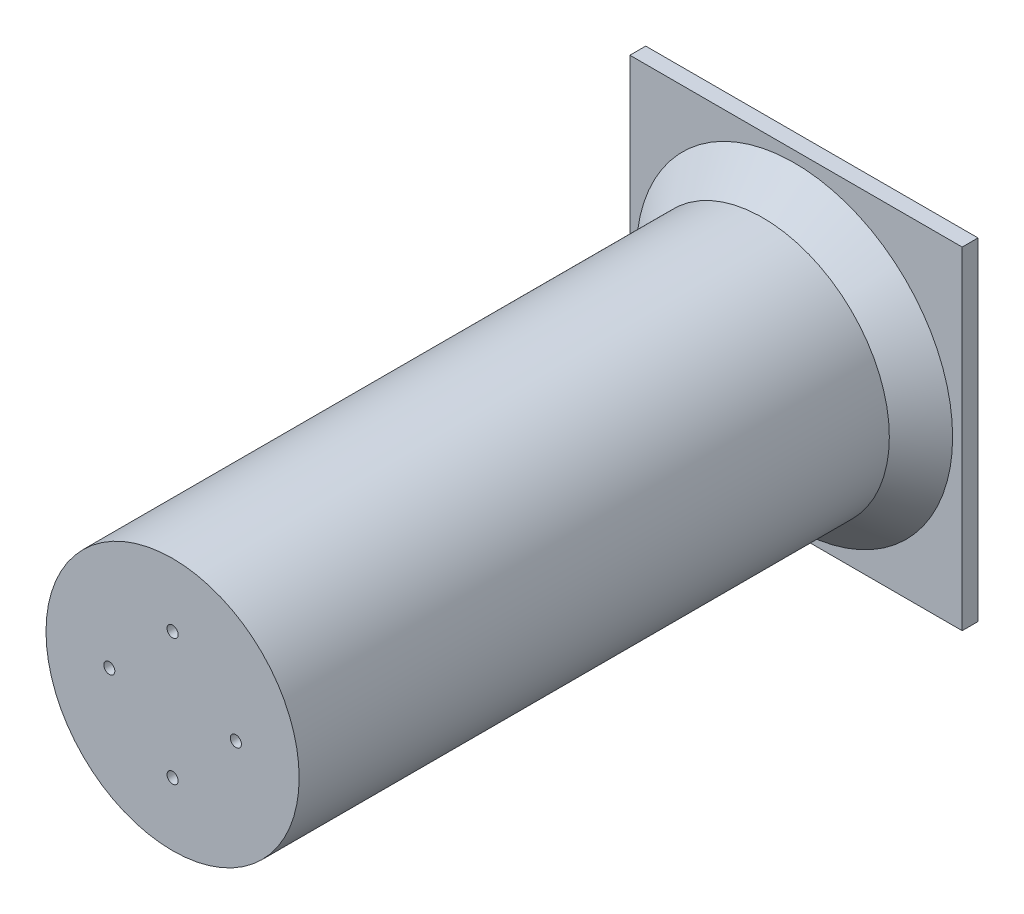
ISO-10303-21;
HEADER;
FILE_DESCRIPTION(('STEP AP214'),'2;1');
FILE_NAME('part.step','',(''),(''),'','','');
FILE_SCHEMA(('AUTOMOTIVE_DESIGN { 1 0 10303 214 1 1 1 1 }'));
ENDSEC;
DATA;
#1=APPLICATION_CONTEXT('core data for automotive mechanical design processes');
#2=APPLICATION_PROTOCOL_DEFINITION('international standard','automotive_design',2000,#1);
#3=PRODUCT_CONTEXT('',#1,'mechanical');
#4=PRODUCT('Part','Part','',(#3));
#5=PRODUCT_RELATED_PRODUCT_CATEGORY('part','',(#4));
#6=PRODUCT_DEFINITION_FORMATION('','',#4);
#7=PRODUCT_DEFINITION_CONTEXT('part definition',#1,'design');
#8=PRODUCT_DEFINITION('design','',#6,#7);
#9=PRODUCT_DEFINITION_SHAPE('','',#8);
#10=(LENGTH_UNIT() NAMED_UNIT(*) SI_UNIT(.MILLI.,.METRE.));
#11=(NAMED_UNIT(*) PLANE_ANGLE_UNIT() SI_UNIT($,.RADIAN.));
#12=(NAMED_UNIT(*) SI_UNIT($,.STERADIAN.) SOLID_ANGLE_UNIT());
#13=UNCERTAINTY_MEASURE_WITH_UNIT(LENGTH_MEASURE(1.E-05),#10,'distance_accuracy_value','');
#14=(GEOMETRIC_REPRESENTATION_CONTEXT(3) GLOBAL_UNCERTAINTY_ASSIGNED_CONTEXT((#13)) GLOBAL_UNIT_ASSIGNED_CONTEXT((#10,
#11,#12)) REPRESENTATION_CONTEXT('',''));
#15=CARTESIAN_POINT('',(0.,0.,0.));
#16=DIRECTION('',(0.,0.,1.));
#17=DIRECTION('',(1.,0.,0.));
#18=AXIS2_PLACEMENT_3D('',#15,#16,#17);
#19=CARTESIAN_POINT('',(-55.1017068131869,20.26268,-15.));
#20=DIRECTION('',(0.,0.,1.));
#21=DIRECTION('',(1.,0.,0.));
#22=AXIS2_PLACEMENT_3D('',#19,#20,#21);
#23=PLANE('',#22);
#24=CARTESIAN_POINT('',(-55.1017068131869,20.26268,-15.));
#25=DIRECTION('',(0.,0.,1.));
#26=DIRECTION('',(1.,0.,0.));
#27=AXIS2_PLACEMENT_3D('',#24,#25,#26);
#28=CIRCLE('',#27,1.75);
#29=CARTESIAN_POINT('',(-53.3517068131869,20.26268,-15.));
#30=VERTEX_POINT('',#29);
#31=EDGE_CURVE('E155',#30,#30,#28,.T.);
#32=ORIENTED_EDGE('',*,*,#31,.T.);
#33=EDGE_LOOP('',(#32));
#34=FACE_BOUND('',#33,.T.);
#35=ADVANCED_FACE('F47',(#34),#23,.T.);
#36=CARTESIAN_POINT('',(-55.1017068131869,20.26268,-15.));
#37=DIRECTION('',(0.,0.,1.));
#38=DIRECTION('',(1.,0.,0.));
#39=AXIS2_PLACEMENT_3D('',#36,#37,#38);
#40=CYLINDRICAL_SURFACE('',#39,1.75);
#41=CARTESIAN_POINT('',(-55.1017068131869,20.26268,0.));
#42=DIRECTION('',(0.,0.,-1.));
#43=DIRECTION('',(-1.,0.,0.));
#44=AXIS2_PLACEMENT_3D('',#41,#42,#43);
#45=CIRCLE('',#44,1.75);
#46=CARTESIAN_POINT('',(-56.8517068131869,20.26268,0.));
#47=VERTEX_POINT('',#46);
#48=EDGE_CURVE('E137',#47,#47,#45,.F.);
#49=ORIENTED_EDGE('',*,*,#48,.T.);
#50=EDGE_LOOP('',(#49));
#51=FACE_BOUND('',#50,.T.);
#52=ORIENTED_EDGE('',*,*,#31,.F.);
#53=EDGE_LOOP('',(#52));
#54=FACE_BOUND('',#53,.T.);
#55=ADVANCED_FACE('F187',(#51,#54),#40,.F.);
#56=CARTESIAN_POINT('',(-117.291706813187,97.76268,0.));
#57=DIRECTION('',(0.,0.,-1.));
#58=DIRECTION('',(-1.,0.,0.));
#59=AXIS2_PLACEMENT_3D('',#56,#57,#58);
#60=PLANE('',#59);
#61=CARTESIAN_POINT('',(-75.1017068131863,0.262679999999647,0.));
#62=DIRECTION('',(0.,0.,-1.));
#63=DIRECTION('',(-1.,0.,0.));
#64=AXIS2_PLACEMENT_3D('',#61,#62,#63);
#65=CIRCLE('',#64,1.75);
#66=CARTESIAN_POINT('',(-76.8517068131863,0.262679999999647,0.));
#67=VERTEX_POINT('',#66);
#68=EDGE_CURVE('E146',#67,#67,#65,.F.);
#69=ORIENTED_EDGE('',*,*,#68,.F.);
#70=EDGE_LOOP('',(#69));
#71=FACE_BOUND('',#70,.T.);
#72=CARTESIAN_POINT('',(-35.1017068131875,0.26268000000033,0.));
#73=DIRECTION('',(0.,0.,-1.));
#74=DIRECTION('',(-1.,0.,0.));
#75=AXIS2_PLACEMENT_3D('',#72,#73,#74);
#76=CIRCLE('',#75,1.75000000000019);
#77=CARTESIAN_POINT('',(-36.8517068131877,0.26268000000033,0.));
#78=VERTEX_POINT('',#77);
#79=EDGE_CURVE('E138',#78,#78,#76,.F.);
#80=ORIENTED_EDGE('',*,*,#79,.F.);
#81=EDGE_LOOP('',(#80));
#82=FACE_BOUND('',#81,.T.);
#83=ORIENTED_EDGE('',*,*,#48,.F.);
#84=EDGE_LOOP('',(#83));
#85=FACE_BOUND('',#84,.T.);
#86=CARTESIAN_POINT('',(-55.1017068131866,-19.7373199999994,0.));
#87=DIRECTION('',(0.,0.,-1.));
#88=DIRECTION('',(-1.,0.,0.));
#89=AXIS2_PLACEMENT_3D('',#86,#87,#88);
#90=CIRCLE('',#89,1.74999999999955);
#91=CARTESIAN_POINT('',(-56.8517068131861,-19.7373199999994,0.));
#92=VERTEX_POINT('',#91);
#93=EDGE_CURVE('E142',#92,#92,#90,.F.);
#94=ORIENTED_EDGE('',*,*,#93,.F.);
#95=EDGE_LOOP('',(#94));
#96=FACE_BOUND('',#95,.T.);
#97=CARTESIAN_POINT('',(-55.1017068131869,0.262679999999987,0.));
#98=DIRECTION('',(0.,0.,-1.));
#99=DIRECTION('',(-1.,0.,0.));
#100=AXIS2_PLACEMENT_3D('',#97,#98,#99);
#101=CIRCLE('',#100,40.);
#102=CARTESIAN_POINT('',(-95.1017068131869,0.262679999999987,0.));
#103=VERTEX_POINT('',#102);
#104=EDGE_CURVE('E150',#103,#103,#101,.T.);
#105=ORIENTED_EDGE('',*,*,#104,.F.);
#106=EDGE_LOOP('',(#105));
#107=FACE_BOUND('',#106,.T.);
#108=ADVANCED_FACE('F194',(#71,#82,#85,#96,#107),#60,.F.);
#109=CARTESIAN_POINT('',(-35.1017068131875,0.26268000000033,-15.));
#110=DIRECTION('',(0.,0.,1.));
#111=DIRECTION('',(1.,0.,0.));
#112=AXIS2_PLACEMENT_3D('',#109,#110,#111);
#113=PLANE('',#112);
#114=CARTESIAN_POINT('',(-35.1017068131875,0.26268000000033,-15.));
#115=DIRECTION('',(0.,0.,1.));
#116=DIRECTION('',(1.,0.,0.));
#117=AXIS2_PLACEMENT_3D('',#114,#115,#116);
#118=CIRCLE('',#117,1.75000000000019);
#119=CARTESIAN_POINT('',(-33.3517068131873,0.26268000000033,-15.));
#120=VERTEX_POINT('',#119);
#121=EDGE_CURVE('E159',#120,#120,#118,.T.);
#122=ORIENTED_EDGE('',*,*,#121,.T.);
#123=EDGE_LOOP('',(#122));
#124=FACE_BOUND('',#123,.T.);
#125=ADVANCED_FACE('F204',(#124),#113,.T.);
#126=CARTESIAN_POINT('',(-35.1017068131875,0.26268000000033,-15.));
#127=DIRECTION('',(0.,0.,1.));
#128=DIRECTION('',(1.,0.,0.));
#129=AXIS2_PLACEMENT_3D('',#126,#127,#128);
#130=CYLINDRICAL_SURFACE('',#129,1.75000000000019);
#131=ORIENTED_EDGE('',*,*,#79,.T.);
#132=EDGE_LOOP('',(#131));
#133=FACE_BOUND('',#132,.T.);
#134=ORIENTED_EDGE('',*,*,#121,.F.);
#135=EDGE_LOOP('',(#134));
#136=FACE_BOUND('',#135,.T.);
#137=ADVANCED_FACE('F200',(#133,#136),#130,.F.);
#138=CARTESIAN_POINT('',(-55.1017068131866,-19.7373199999994,-15.));
#139=DIRECTION('',(0.,0.,1.));
#140=DIRECTION('',(1.,0.,0.));
#141=AXIS2_PLACEMENT_3D('',#138,#139,#140);
#142=PLANE('',#141);
#143=CARTESIAN_POINT('',(-55.1017068131866,-19.7373199999994,-15.));
#144=DIRECTION('',(0.,0.,1.));
#145=DIRECTION('',(1.,0.,0.));
#146=AXIS2_PLACEMENT_3D('',#143,#144,#145);
#147=CIRCLE('',#146,1.74999999999955);
#148=CARTESIAN_POINT('',(-53.351706813187,-19.7373199999994,-15.));
#149=VERTEX_POINT('',#148);
#150=EDGE_CURVE('E163',#149,#149,#147,.T.);
#151=ORIENTED_EDGE('',*,*,#150,.T.);
#152=EDGE_LOOP('',(#151));
#153=FACE_BOUND('',#152,.T.);
#154=ADVANCED_FACE('F203',(#153),#142,.T.);
#155=CARTESIAN_POINT('',(-55.1017068131866,-19.7373199999994,-15.));
#156=DIRECTION('',(0.,0.,1.));
#157=DIRECTION('',(1.,0.,0.));
#158=AXIS2_PLACEMENT_3D('',#155,#156,#157);
#159=CYLINDRICAL_SURFACE('',#158,1.74999999999955);
#160=ORIENTED_EDGE('',*,*,#93,.T.);
#161=EDGE_LOOP('',(#160));
#162=FACE_BOUND('',#161,.T.);
#163=ORIENTED_EDGE('',*,*,#150,.F.);
#164=EDGE_LOOP('',(#163));
#165=FACE_BOUND('',#164,.T.);
#166=ADVANCED_FACE('F208',(#162,#165),#159,.F.);
#167=CARTESIAN_POINT('',(-75.1017068131863,0.262679999999647,-15.));
#168=DIRECTION('',(0.,0.,1.));
#169=DIRECTION('',(1.,0.,0.));
#170=AXIS2_PLACEMENT_3D('',#167,#168,#169);
#171=PLANE('',#170);
#172=CARTESIAN_POINT('',(-75.1017068131863,0.262679999999647,-15.));
#173=DIRECTION('',(0.,0.,1.));
#174=DIRECTION('',(1.,0.,0.));
#175=AXIS2_PLACEMENT_3D('',#172,#173,#174);
#176=CIRCLE('',#175,1.75);
#177=CARTESIAN_POINT('',(-73.3517068131863,0.262679999999647,-15.));
#178=VERTEX_POINT('',#177);
#179=EDGE_CURVE('E154',#178,#178,#176,.T.);
#180=ORIENTED_EDGE('',*,*,#179,.T.);
#181=EDGE_LOOP('',(#180));
#182=FACE_BOUND('',#181,.T.);
#183=ADVANCED_FACE('F211',(#182),#171,.T.);
#184=CARTESIAN_POINT('',(-75.1017068131863,0.262679999999647,-15.));
#185=DIRECTION('',(0.,0.,1.));
#186=DIRECTION('',(1.,0.,0.));
#187=AXIS2_PLACEMENT_3D('',#184,#185,#186);
#188=CYLINDRICAL_SURFACE('',#187,1.75);
#189=ORIENTED_EDGE('',*,*,#68,.T.);
#190=EDGE_LOOP('',(#189));
#191=FACE_BOUND('',#190,.T.);
#192=ORIENTED_EDGE('',*,*,#179,.F.);
#193=EDGE_LOOP('',(#192));
#194=FACE_BOUND('',#193,.T.);
#195=ADVANCED_FACE('F216',(#191,#194),#188,.F.);
#196=CARTESIAN_POINT('',(-55.1017068131869,0.262679999999987,-196.5));
#197=DIRECTION('',(0.,0.,1.));
#198=DIRECTION('',(1.,0.,0.));
#199=AXIS2_PLACEMENT_3D('',#196,#197,#198);
#200=CYLINDRICAL_SURFACE('',#199,40.);
#201=CARTESIAN_POINT('',(-55.1017068131869,0.262679999999987,-186.5));
#202=DIRECTION('',(0.,0.,1.));
#203=DIRECTION('',(1.,0.,0.));
#204=AXIS2_PLACEMENT_3D('',#201,#202,#203);
#205=CIRCLE('',#204,40.);
#206=CARTESIAN_POINT('',(-15.1017068131869,0.262679999999987,-186.5));
#207=VERTEX_POINT('',#206);
#208=EDGE_CURVE('E11',#207,#207,#205,.T.);
#209=ORIENTED_EDGE('',*,*,#208,.T.);
#210=EDGE_LOOP('',(#209));
#211=FACE_BOUND('',#210,.T.);
#212=ORIENTED_EDGE('',*,*,#104,.T.);
#213=EDGE_LOOP('',(#212));
#214=FACE_BOUND('',#213,.T.);
#215=ADVANCED_FACE('F219',(#211,#214),#200,.T.);
#216=CARTESIAN_POINT('',(-107.083486428447,-51.2668436534329,-201.5));
#217=DIRECTION('',(1.,0.,0.));
#218=DIRECTION('',(0.,0.,-1.));
#219=AXIS2_PLACEMENT_3D('',#216,#217,#218);
#220=PLANE('',#219);
#221=DIRECTION('',(0.,1.,0.));
#222=VECTOR('',#221,1.);
#223=CARTESIAN_POINT('',(-107.083486428447,-51.2668436534329,-196.5));
#224=LINE('',#223,#222);
#225=CARTESIAN_POINT('',(-107.083486428447,-51.2668436534329,-196.5));
#226=VERTEX_POINT('',#225);
#227=CARTESIAN_POINT('',(-107.083486428447,53.7331563465671,-196.5));
#228=VERTEX_POINT('',#227);
#229=EDGE_CURVE('E121',#226,#228,#224,.T.);
#230=ORIENTED_EDGE('',*,*,#229,.T.);
#231=DIRECTION('',(0.,0.,1.));
#232=VECTOR('',#231,1.);
#233=CARTESIAN_POINT('',(-107.083486428447,53.7331563465671,-201.5));
#234=LINE('',#233,#232);
#235=CARTESIAN_POINT('',(-107.083486428447,53.7331563465671,-201.5));
#236=VERTEX_POINT('',#235);
#237=EDGE_CURVE('E110',#236,#228,#234,.T.);
#238=ORIENTED_EDGE('',*,*,#237,.F.);
#239=DIRECTION('',(0.,1.,0.));
#240=VECTOR('',#239,1.);
#241=CARTESIAN_POINT('',(-107.083486428447,-51.2668436534329,-201.5));
#242=LINE('',#241,#240);
#243=CARTESIAN_POINT('',(-107.083486428447,-51.2668436534329,-201.5));
#244=VERTEX_POINT('',#243);
#245=EDGE_CURVE('E102',#244,#236,#242,.T.);
#246=ORIENTED_EDGE('',*,*,#245,.F.);
#247=DIRECTION('',(0.,0.,1.));
#248=VECTOR('',#247,1.);
#249=CARTESIAN_POINT('',(-107.083486428447,-51.2668436534329,-201.5));
#250=LINE('',#249,#248);
#251=EDGE_CURVE('E117',#244,#226,#250,.T.);
#252=ORIENTED_EDGE('',*,*,#251,.T.);
#253=EDGE_LOOP('',(#230,#238,#246,#252));
#254=FACE_BOUND('',#253,.T.);
#255=ADVANCED_FACE('F224',(#254),#220,.F.);
#256=CARTESIAN_POINT('',(-2.08348642844669,53.7331563465671,-201.5));
#257=DIRECTION('',(0.,-1.,0.));
#258=DIRECTION('',(0.,0.,-1.));
#259=AXIS2_PLACEMENT_3D('',#256,#257,#258);
#260=PLANE('',#259);
#261=DIRECTION('',(1.,0.,0.));
#262=VECTOR('',#261,1.);
#263=CARTESIAN_POINT('',(-2.08348642844669,53.7331563465671,-196.5));
#264=LINE('',#263,#262);
#265=CARTESIAN_POINT('',(-2.08348642844669,53.7331563465671,-196.5));
#266=VERTEX_POINT('',#265);
#267=EDGE_CURVE('E108',#228,#266,#264,.T.);
#268=ORIENTED_EDGE('',*,*,#267,.T.);
#269=DIRECTION('',(0.,0.,1.));
#270=VECTOR('',#269,1.);
#271=CARTESIAN_POINT('',(-2.08348642844669,53.7331563465671,-201.5));
#272=LINE('',#271,#270);
#273=CARTESIAN_POINT('',(-2.08348642844669,53.7331563465671,-201.5));
#274=VERTEX_POINT('',#273);
#275=EDGE_CURVE('E106',#274,#266,#272,.T.);
#276=ORIENTED_EDGE('',*,*,#275,.F.);
#277=DIRECTION('',(1.,0.,0.));
#278=VECTOR('',#277,1.);
#279=CARTESIAN_POINT('',(-2.08348642844669,53.7331563465671,-201.5));
#280=LINE('',#279,#278);
#281=EDGE_CURVE('E97',#236,#274,#280,.T.);
#282=ORIENTED_EDGE('',*,*,#281,.F.);
#283=ORIENTED_EDGE('',*,*,#237,.T.);
#284=EDGE_LOOP('',(#268,#276,#282,#283));
#285=FACE_BOUND('',#284,.T.);
#286=ADVANCED_FACE('F107',(#285),#260,.F.);
#287=CARTESIAN_POINT('',(-2.08348642844669,-51.2668436534329,-201.5));
#288=DIRECTION('',(-1.,0.,0.));
#289=DIRECTION('',(0.,0.,1.));
#290=AXIS2_PLACEMENT_3D('',#287,#288,#289);
#291=PLANE('',#290);
#292=DIRECTION('',(0.,-1.,0.));
#293=VECTOR('',#292,1.);
#294=CARTESIAN_POINT('',(-2.08348642844669,-51.2668436534329,-196.5));
#295=LINE('',#294,#293);
#296=CARTESIAN_POINT('',(-2.08348642844669,-51.2668436534329,-196.5));
#297=VERTEX_POINT('',#296);
#298=EDGE_CURVE('E83',#266,#297,#295,.T.);
#299=ORIENTED_EDGE('',*,*,#298,.T.);
#300=DIRECTION('',(0.,0.,1.));
#301=VECTOR('',#300,1.);
#302=CARTESIAN_POINT('',(-2.08348642844669,-51.2668436534329,-201.5));
#303=LINE('',#302,#301);
#304=CARTESIAN_POINT('',(-2.08348642844669,-51.2668436534329,-201.5));
#305=VERTEX_POINT('',#304);
#306=EDGE_CURVE('E111',#305,#297,#303,.T.);
#307=ORIENTED_EDGE('',*,*,#306,.F.);
#308=DIRECTION('',(0.,-1.,0.));
#309=VECTOR('',#308,1.);
#310=CARTESIAN_POINT('',(-2.08348642844669,-51.2668436534329,-201.5));
#311=LINE('',#310,#309);
#312=EDGE_CURVE('E100',#274,#305,#311,.T.);
#313=ORIENTED_EDGE('',*,*,#312,.F.);
#314=ORIENTED_EDGE('',*,*,#275,.T.);
#315=EDGE_LOOP('',(#299,#307,#313,#314));
#316=FACE_BOUND('',#315,.T.);
#317=ADVANCED_FACE('F113',(#316),#291,.F.);
#318=CARTESIAN_POINT('',(-2.08348642844669,-51.2668436534329,-201.5));
#319=DIRECTION('',(0.,1.,0.));
#320=DIRECTION('',(0.,0.,1.));
#321=AXIS2_PLACEMENT_3D('',#318,#319,#320);
#322=PLANE('',#321);
#323=DIRECTION('',(-1.,0.,0.));
#324=VECTOR('',#323,1.);
#325=CARTESIAN_POINT('',(-2.08348642844669,-51.2668436534329,-196.5));
#326=LINE('',#325,#324);
#327=EDGE_CURVE('E89',#297,#226,#326,.T.);
#328=ORIENTED_EDGE('',*,*,#327,.T.);
#329=ORIENTED_EDGE('',*,*,#251,.F.);
#330=DIRECTION('',(-1.,0.,0.));
#331=VECTOR('',#330,1.);
#332=CARTESIAN_POINT('',(-2.08348642844669,-51.2668436534329,-201.5));
#333=LINE('',#332,#331);
#334=EDGE_CURVE('E66',#305,#244,#333,.T.);
#335=ORIENTED_EDGE('',*,*,#334,.F.);
#336=ORIENTED_EDGE('',*,*,#306,.T.);
#337=EDGE_LOOP('',(#328,#329,#335,#336));
#338=FACE_BOUND('',#337,.T.);
#339=ADVANCED_FACE('F292',(#338),#322,.F.);
#340=CARTESIAN_POINT('',(0.,0.,-201.5));
#341=DIRECTION('',(0.,0.,1.));
#342=DIRECTION('',(1.,0.,0.));
#343=AXIS2_PLACEMENT_3D('',#340,#341,#342);
#344=PLANE('',#343);
#345=ORIENTED_EDGE('',*,*,#245,.T.);
#346=ORIENTED_EDGE('',*,*,#281,.T.);
#347=ORIENTED_EDGE('',*,*,#312,.T.);
#348=ORIENTED_EDGE('',*,*,#334,.T.);
#349=EDGE_LOOP('',(#345,#346,#347,#348));
#350=FACE_BOUND('',#349,.T.);
#351=ADVANCED_FACE('F98',(#350),#344,.F.);
#352=CARTESIAN_POINT('',(0.,0.,-196.5));
#353=DIRECTION('',(0.,0.,1.));
#354=DIRECTION('',(1.,0.,0.));
#355=AXIS2_PLACEMENT_3D('',#352,#353,#354);
#356=PLANE('',#355);
#357=CARTESIAN_POINT('',(-55.1017068131869,0.262679999999987,-196.5));
#358=DIRECTION('',(0.,0.,1.));
#359=DIRECTION('',(1.,0.,0.));
#360=AXIS2_PLACEMENT_3D('',#357,#358,#359);
#361=CIRCLE('',#360,50.0000000000001);
#362=CARTESIAN_POINT('',(-5.10170681318684,0.262679999999987,-196.5));
#363=VERTEX_POINT('',#362);
#364=EDGE_CURVE('E58',#363,#363,#361,.F.);
#365=ORIENTED_EDGE('',*,*,#364,.T.);
#366=EDGE_LOOP('',(#365));
#367=FACE_BOUND('',#366,.T.);
#368=ORIENTED_EDGE('',*,*,#229,.F.);
#369=ORIENTED_EDGE('',*,*,#327,.F.);
#370=ORIENTED_EDGE('',*,*,#298,.F.);
#371=ORIENTED_EDGE('',*,*,#267,.F.);
#372=EDGE_LOOP('',(#368,#369,#370,#371));
#373=FACE_BOUND('',#372,.T.);
#374=ADVANCED_FACE('F176',(#367,#373),#356,.T.);
#375=CARTESIAN_POINT('',(-55.1017068131869,0.262679999999987,-196.5));
#376=DIRECTION('',(0.,0.,-1.));
#377=DIRECTION('',(-1.,0.,0.));
#378=AXIS2_PLACEMENT_3D('',#375,#376,#377);
#379=CONICAL_SURFACE('',#378,50.0000000000001,0.785398163397454);
#380=ORIENTED_EDGE('',*,*,#208,.F.);
#381=EDGE_LOOP('',(#380));
#382=FACE_BOUND('',#381,.T.);
#383=ORIENTED_EDGE('',*,*,#364,.F.);
#384=EDGE_LOOP('',(#383));
#385=FACE_BOUND('',#384,.T.);
#386=ADVANCED_FACE('F50',(#382,#385),#379,.T.);
#387=CLOSED_SHELL('',(#35,#55,#108,#125,#137,#154,#166,#183,#195,#215,#255,#286,#317,#339,#351,
#374,#386));
#388=MANIFOLD_SOLID_BREP('B2',#387);
#389=ADVANCED_BREP_SHAPE_REPRESENTATION('',(#18,#388),#14);
#390=SHAPE_DEFINITION_REPRESENTATION(#9,#389);
ENDSEC;
END-ISO-10303-21;
